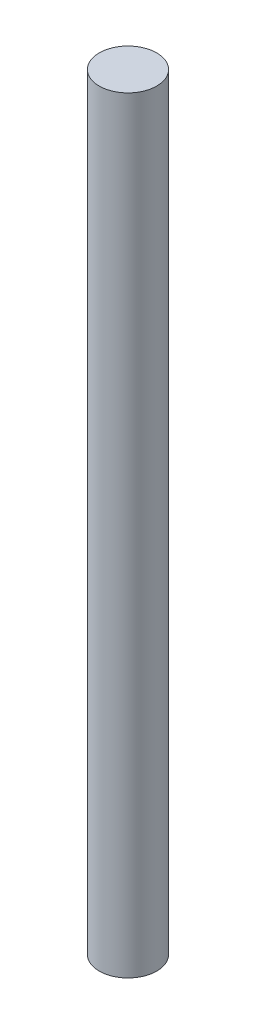
ISO-10303-21;
HEADER;
FILE_DESCRIPTION(('STEP AP214'),'2;1');
FILE_NAME('part.step','',(''),(''),'','','');
FILE_SCHEMA(('AUTOMOTIVE_DESIGN { 1 0 10303 214 1 1 1 1 }'));
ENDSEC;
DATA;
#1=APPLICATION_CONTEXT('core data for automotive mechanical design processes');
#2=APPLICATION_PROTOCOL_DEFINITION('international standard','automotive_design',2000,#1);
#3=PRODUCT_CONTEXT('',#1,'mechanical');
#4=PRODUCT('Part','Part','',(#3));
#5=PRODUCT_RELATED_PRODUCT_CATEGORY('part','',(#4));
#6=PRODUCT_DEFINITION_FORMATION('','',#4);
#7=PRODUCT_DEFINITION_CONTEXT('part definition',#1,'design');
#8=PRODUCT_DEFINITION('design','',#6,#7);
#9=PRODUCT_DEFINITION_SHAPE('','',#8);
#10=(LENGTH_UNIT() NAMED_UNIT(*) SI_UNIT(.MILLI.,.METRE.));
#11=(NAMED_UNIT(*) PLANE_ANGLE_UNIT() SI_UNIT($,.RADIAN.));
#12=(NAMED_UNIT(*) SI_UNIT($,.STERADIAN.) SOLID_ANGLE_UNIT());
#13=UNCERTAINTY_MEASURE_WITH_UNIT(LENGTH_MEASURE(1.E-05),#10,'distance_accuracy_value','');
#14=(GEOMETRIC_REPRESENTATION_CONTEXT(3) GLOBAL_UNCERTAINTY_ASSIGNED_CONTEXT((#13)) GLOBAL_UNIT_ASSIGNED_CONTEXT((#10,
#11,#12)) REPRESENTATION_CONTEXT('',''));
#15=CARTESIAN_POINT('',(0.,0.,0.));
#16=DIRECTION('',(0.,0.,1.));
#17=DIRECTION('',(1.,0.,0.));
#18=AXIS2_PLACEMENT_3D('',#15,#16,#17);
#19=CARTESIAN_POINT('',(0.,40.,0.));
#20=DIRECTION('',(0.,-1.,0.));
#21=DIRECTION('',(0.,0.,-1.));
#22=AXIS2_PLACEMENT_3D('',#19,#20,#21);
#23=CYLINDRICAL_SURFACE('',#22,1.5);
#24=CARTESIAN_POINT('',(0.,40.,0.));
#25=DIRECTION('',(0.,1.,0.));
#26=DIRECTION('',(0.,0.,1.));
#27=AXIS2_PLACEMENT_3D('',#24,#25,#26);
#28=CIRCLE('',#27,1.5);
#29=CARTESIAN_POINT('',(0.,40.,1.5));
#30=VERTEX_POINT('',#29);
#31=EDGE_CURVE('E10',#30,#30,#28,.T.);
#32=ORIENTED_EDGE('',*,*,#31,.F.);
#33=EDGE_LOOP('',(#32));
#34=FACE_BOUND('',#33,.T.);
#35=CARTESIAN_POINT('',(0.,0.,0.));
#36=DIRECTION('',(0.,1.,0.));
#37=DIRECTION('',(0.,0.,1.));
#38=AXIS2_PLACEMENT_3D('',#35,#36,#37);
#39=CIRCLE('',#38,1.5);
#40=CARTESIAN_POINT('',(0.,0.,1.5));
#41=VERTEX_POINT('',#40);
#42=EDGE_CURVE('E32',#41,#41,#39,.T.);
#43=ORIENTED_EDGE('',*,*,#42,.T.);
#44=EDGE_LOOP('',(#43));
#45=FACE_BOUND('',#44,.T.);
#46=ADVANCED_FACE('F29',(#34,#45),#23,.T.);
#47=CARTESIAN_POINT('',(0.,40.,0.));
#48=DIRECTION('',(0.,1.,0.));
#49=DIRECTION('',(0.,0.,1.));
#50=AXIS2_PLACEMENT_3D('',#47,#48,#49);
#51=PLANE('',#50);
#52=ORIENTED_EDGE('',*,*,#31,.T.);
#53=EDGE_LOOP('',(#52));
#54=FACE_BOUND('',#53,.T.);
#55=ADVANCED_FACE('F44',(#54),#51,.T.);
#56=CARTESIAN_POINT('',(0.,0.,0.));
#57=DIRECTION('',(0.,1.,0.));
#58=DIRECTION('',(0.,0.,1.));
#59=AXIS2_PLACEMENT_3D('',#56,#57,#58);
#60=PLANE('',#59);
#61=ORIENTED_EDGE('',*,*,#42,.F.);
#62=EDGE_LOOP('',(#61));
#63=FACE_BOUND('',#62,.T.);
#64=ADVANCED_FACE('F42',(#63),#60,.F.);
#65=CLOSED_SHELL('',(#46,#55,#64));
#66=MANIFOLD_SOLID_BREP('B2',#65);
#67=ADVANCED_BREP_SHAPE_REPRESENTATION('',(#18,#66),#14);
#68=SHAPE_DEFINITION_REPRESENTATION(#9,#67);
ENDSEC;
END-ISO-10303-21;
